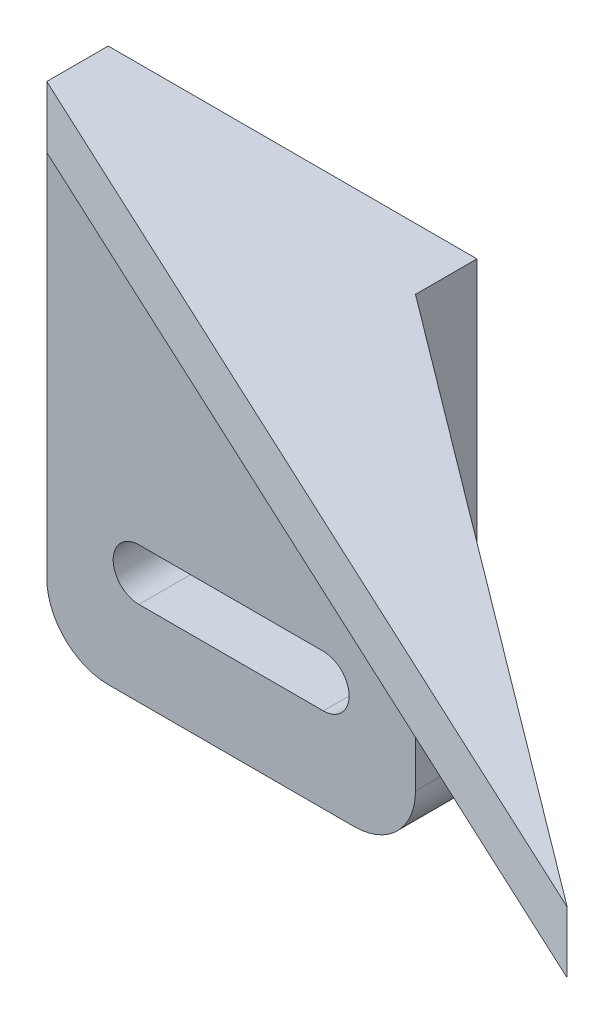
ISO-10303-21;
HEADER;
FILE_DESCRIPTION(('STEP AP214'),'2;1');
FILE_NAME('part.step','',(''),(''),'','','');
FILE_SCHEMA(('AUTOMOTIVE_DESIGN { 1 0 10303 214 1 1 1 1 }'));
ENDSEC;
DATA;
#1=APPLICATION_CONTEXT('core data for automotive mechanical design processes');
#2=APPLICATION_PROTOCOL_DEFINITION('international standard','automotive_design',2000,#1);
#3=PRODUCT_CONTEXT('',#1,'mechanical');
#4=PRODUCT('Part','Part','',(#3));
#5=PRODUCT_RELATED_PRODUCT_CATEGORY('part','',(#4));
#6=PRODUCT_DEFINITION_FORMATION('','',#4);
#7=PRODUCT_DEFINITION_CONTEXT('part definition',#1,'design');
#8=PRODUCT_DEFINITION('design','',#6,#7);
#9=PRODUCT_DEFINITION_SHAPE('','',#8);
#10=(LENGTH_UNIT() NAMED_UNIT(*) SI_UNIT(.MILLI.,.METRE.));
#11=(NAMED_UNIT(*) PLANE_ANGLE_UNIT() SI_UNIT($,.RADIAN.));
#12=(NAMED_UNIT(*) SI_UNIT($,.STERADIAN.) SOLID_ANGLE_UNIT());
#13=UNCERTAINTY_MEASURE_WITH_UNIT(LENGTH_MEASURE(1.E-05),#10,'distance_accuracy_value','');
#14=(GEOMETRIC_REPRESENTATION_CONTEXT(3) GLOBAL_UNCERTAINTY_ASSIGNED_CONTEXT((#13)) GLOBAL_UNIT_ASSIGNED_CONTEXT((#10,
#11,#12)) REPRESENTATION_CONTEXT('',''));
#15=CARTESIAN_POINT('',(0.,0.,0.));
#16=DIRECTION('',(0.,0.,1.));
#17=DIRECTION('',(1.,0.,0.));
#18=AXIS2_PLACEMENT_3D('',#15,#16,#17);
#19=CARTESIAN_POINT('',(0.,0.,5.));
#20=DIRECTION('',(0.,0.,1.));
#21=DIRECTION('',(1.,0.,0.));
#22=AXIS2_PLACEMENT_3D('',#19,#20,#21);
#23=PLANE('',#22);
#24=CARTESIAN_POINT('',(-7.5,-11.,5.));
#25=DIRECTION('',(0.,0.,-1.));
#26=DIRECTION('',(-1.,0.,0.));
#27=AXIS2_PLACEMENT_3D('',#24,#25,#26);
#28=CIRCLE('',#27,2.1);
#29=CARTESIAN_POINT('',(-7.5,-13.1,5.));
#30=VERTEX_POINT('',#29);
#31=CARTESIAN_POINT('',(-7.5,-8.9,5.));
#32=VERTEX_POINT('',#31);
#33=EDGE_CURVE('E123',#30,#32,#28,.T.);
#34=ORIENTED_EDGE('',*,*,#33,.T.);
#35=DIRECTION('',(1.,0.,0.));
#36=VECTOR('',#35,1.);
#37=CARTESIAN_POINT('',(-7.5,-8.9,5.));
#38=LINE('',#37,#36);
#39=CARTESIAN_POINT('',(7.5,-8.9,5.));
#40=VERTEX_POINT('',#39);
#41=EDGE_CURVE('E132',#32,#40,#38,.T.);
#42=ORIENTED_EDGE('',*,*,#41,.T.);
#43=CARTESIAN_POINT('',(7.5,-11.,5.));
#44=DIRECTION('',(0.,0.,-1.));
#45=DIRECTION('',(-1.,0.,0.));
#46=AXIS2_PLACEMENT_3D('',#43,#44,#45);
#47=CIRCLE('',#46,2.1);
#48=CARTESIAN_POINT('',(7.5,-13.1,5.));
#49=VERTEX_POINT('',#48);
#50=EDGE_CURVE('E48',#40,#49,#47,.T.);
#51=ORIENTED_EDGE('',*,*,#50,.T.);
#52=DIRECTION('',(-1.,0.,0.));
#53=VECTOR('',#52,1.);
#54=CARTESIAN_POINT('',(-7.5,-13.1,5.));
#55=LINE('',#54,#53);
#56=EDGE_CURVE('E129',#49,#30,#55,.T.);
#57=ORIENTED_EDGE('',*,*,#56,.T.);
#58=EDGE_LOOP('',(#34,#42,#51,#57));
#59=FACE_BOUND('',#58,.T.);
#60=DIRECTION('',(1.,0.,0.));
#61=VECTOR('',#60,1.);
#62=CARTESIAN_POINT('',(15.,-20.,5.));
#63=LINE('',#62,#61);
#64=CARTESIAN_POINT('',(-9.99999999999999,-20.,5.));
#65=VERTEX_POINT('',#64);
#66=CARTESIAN_POINT('',(10.,-20.,5.));
#67=VERTEX_POINT('',#66);
#68=EDGE_CURVE('E179',#65,#67,#63,.T.);
#69=ORIENTED_EDGE('',*,*,#68,.T.);
#70=CARTESIAN_POINT('',(10.,-15.,5.));
#71=DIRECTION('',(0.,0.,1.));
#72=DIRECTION('',(1.,0.,0.));
#73=AXIS2_PLACEMENT_3D('',#70,#71,#72);
#74=CIRCLE('',#73,5.);
#75=CARTESIAN_POINT('',(15.,-15.,5.));
#76=VERTEX_POINT('',#75);
#77=EDGE_CURVE('E41',#67,#76,#74,.T.);
#78=ORIENTED_EDGE('',*,*,#77,.T.);
#79=DIRECTION('',(0.,1.,0.));
#80=VECTOR('',#79,1.);
#81=CARTESIAN_POINT('',(15.,-20.,5.));
#82=LINE('',#81,#80);
#83=CARTESIAN_POINT('',(15.,15.,5.));
#84=VERTEX_POINT('',#83);
#85=EDGE_CURVE('E183',#76,#84,#82,.T.);
#86=ORIENTED_EDGE('',*,*,#85,.T.);
#87=DIRECTION('',(-1.,0.,0.));
#88=VECTOR('',#87,1.);
#89=CARTESIAN_POINT('',(-15.,15.,5.));
#90=LINE('',#89,#88);
#91=CARTESIAN_POINT('',(-15.,15.,5.));
#92=VERTEX_POINT('',#91);
#93=EDGE_CURVE('E157',#84,#92,#90,.T.);
#94=ORIENTED_EDGE('',*,*,#93,.T.);
#95=DIRECTION('',(0.,-1.,0.));
#96=VECTOR('',#95,1.);
#97=CARTESIAN_POINT('',(-15.,-20.,5.));
#98=LINE('',#97,#96);
#99=CARTESIAN_POINT('',(-15.,-15.,5.));
#100=VERTEX_POINT('',#99);
#101=EDGE_CURVE('E180',#92,#100,#98,.T.);
#102=ORIENTED_EDGE('',*,*,#101,.T.);
#103=CARTESIAN_POINT('',(-10.,-15.,5.));
#104=DIRECTION('',(0.,0.,1.));
#105=DIRECTION('',(1.,0.,0.));
#106=AXIS2_PLACEMENT_3D('',#103,#104,#105);
#107=CIRCLE('',#106,5.);
#108=EDGE_CURVE('E212',#100,#65,#107,.T.);
#109=ORIENTED_EDGE('',*,*,#108,.T.);
#110=EDGE_LOOP('',(#69,#78,#86,#94,#102,#109));
#111=FACE_BOUND('',#110,.T.);
#112=ADVANCED_FACE('F33',(#59,#111),#23,.T.);
#113=CARTESIAN_POINT('',(-15.,-20.,5.));
#114=DIRECTION('',(1.,0.,0.));
#115=DIRECTION('',(0.,0.,-1.));
#116=AXIS2_PLACEMENT_3D('',#113,#114,#115);
#117=PLANE('',#116);
#118=DIRECTION('',(0.,-1.,0.));
#119=VECTOR('',#118,1.);
#120=CARTESIAN_POINT('',(-15.,-20.,0.));
#121=LINE('',#120,#119);
#122=CARTESIAN_POINT('',(-15.,20.,0.));
#123=VERTEX_POINT('',#122);
#124=CARTESIAN_POINT('',(-15.,-15.,0.));
#125=VERTEX_POINT('',#124);
#126=EDGE_CURVE('E174',#123,#125,#121,.T.);
#127=ORIENTED_EDGE('',*,*,#126,.T.);
#128=DIRECTION('',(0.,0.,-1.));
#129=VECTOR('',#128,1.);
#130=CARTESIAN_POINT('',(-15.,-15.,5.));
#131=LINE('',#130,#129);
#132=EDGE_CURVE('E11',#125,#100,#131,.F.);
#133=ORIENTED_EDGE('',*,*,#132,.T.);
#134=ORIENTED_EDGE('',*,*,#101,.F.);
#135=CARTESIAN_POINT('',(-15.,20.,5.));
#136=VERTEX_POINT('',#135);
#137=EDGE_CURVE('E176',#136,#92,#98,.T.);
#138=ORIENTED_EDGE('',*,*,#137,.F.);
#139=DIRECTION('',(0.,0.,-1.));
#140=VECTOR('',#139,1.);
#141=CARTESIAN_POINT('',(-15.,20.,5.));
#142=LINE('',#141,#140);
#143=EDGE_CURVE('E185',#136,#123,#142,.T.);
#144=ORIENTED_EDGE('',*,*,#143,.T.);
#145=EDGE_LOOP('',(#127,#133,#134,#138,#144));
#146=FACE_BOUND('',#145,.T.);
#147=ADVANCED_FACE('F238',(#146),#117,.F.);
#148=CARTESIAN_POINT('',(15.,-20.,5.));
#149=DIRECTION('',(0.,1.,0.));
#150=DIRECTION('',(-1.,0.,0.));
#151=AXIS2_PLACEMENT_3D('',#148,#149,#150);
#152=PLANE('',#151);
#153=DIRECTION('',(1.,0.,0.));
#154=VECTOR('',#153,1.);
#155=CARTESIAN_POINT('',(15.,-20.,0.));
#156=LINE('',#155,#154);
#157=CARTESIAN_POINT('',(-9.99999999999999,-20.,0.));
#158=VERTEX_POINT('',#157);
#159=CARTESIAN_POINT('',(10.,-20.,0.));
#160=VERTEX_POINT('',#159);
#161=EDGE_CURVE('E188',#158,#160,#156,.T.);
#162=ORIENTED_EDGE('',*,*,#161,.T.);
#163=DIRECTION('',(0.,0.,-1.));
#164=VECTOR('',#163,1.);
#165=CARTESIAN_POINT('',(10.,-20.,5.));
#166=LINE('',#165,#164);
#167=EDGE_CURVE('E210',#160,#67,#166,.F.);
#168=ORIENTED_EDGE('',*,*,#167,.T.);
#169=ORIENTED_EDGE('',*,*,#68,.F.);
#170=DIRECTION('',(0.,0.,-1.));
#171=VECTOR('',#170,1.);
#172=CARTESIAN_POINT('',(-9.99999999999999,-20.,5.));
#173=LINE('',#172,#171);
#174=EDGE_CURVE('E207',#65,#158,#173,.T.);
#175=ORIENTED_EDGE('',*,*,#174,.T.);
#176=EDGE_LOOP('',(#162,#168,#169,#175));
#177=FACE_BOUND('',#176,.T.);
#178=ADVANCED_FACE('F231',(#177),#152,.F.);
#179=CARTESIAN_POINT('',(15.,-20.,5.));
#180=DIRECTION('',(-1.,0.,0.));
#181=DIRECTION('',(0.,0.,1.));
#182=AXIS2_PLACEMENT_3D('',#179,#180,#181);
#183=PLANE('',#182);
#184=ORIENTED_EDGE('',*,*,#85,.F.);
#185=DIRECTION('',(0.,0.,-1.));
#186=VECTOR('',#185,1.);
#187=CARTESIAN_POINT('',(15.,-15.,5.));
#188=LINE('',#187,#186);
#189=CARTESIAN_POINT('',(15.,-15.,0.));
#190=VERTEX_POINT('',#189);
#191=EDGE_CURVE('E200',#76,#190,#188,.T.);
#192=ORIENTED_EDGE('',*,*,#191,.T.);
#193=DIRECTION('',(0.,1.,0.));
#194=VECTOR('',#193,1.);
#195=CARTESIAN_POINT('',(15.,-20.,0.));
#196=LINE('',#195,#194);
#197=CARTESIAN_POINT('',(15.,20.,0.));
#198=VERTEX_POINT('',#197);
#199=EDGE_CURVE('E191',#190,#198,#196,.T.);
#200=ORIENTED_EDGE('',*,*,#199,.T.);
#201=DIRECTION('',(0.,0.,-1.));
#202=VECTOR('',#201,1.);
#203=CARTESIAN_POINT('',(15.,20.,5.));
#204=LINE('',#203,#202);
#205=CARTESIAN_POINT('',(15.,20.,5.));
#206=VERTEX_POINT('',#205);
#207=EDGE_CURVE('E197',#206,#198,#204,.T.);
#208=ORIENTED_EDGE('',*,*,#207,.F.);
#209=DIRECTION('',(0.,1.,0.));
#210=VECTOR('',#209,1.);
#211=CARTESIAN_POINT('',(15.,15.,5.));
#212=LINE('',#211,#210);
#213=EDGE_CURVE('E172',#84,#206,#212,.T.);
#214=ORIENTED_EDGE('',*,*,#213,.F.);
#215=EDGE_LOOP('',(#184,#192,#200,#208,#214));
#216=FACE_BOUND('',#215,.T.);
#217=ADVANCED_FACE('F222',(#216),#183,.F.);
#218=CARTESIAN_POINT('',(15.,20.,5.));
#219=DIRECTION('',(0.,-1.,0.));
#220=DIRECTION('',(0.,0.,-1.));
#221=AXIS2_PLACEMENT_3D('',#218,#219,#220);
#222=PLANE('',#221);
#223=DIRECTION('',(-1.,0.,0.));
#224=VECTOR('',#223,1.);
#225=CARTESIAN_POINT('',(15.,20.,0.));
#226=LINE('',#225,#224);
#227=EDGE_CURVE('E193',#198,#123,#226,.T.);
#228=ORIENTED_EDGE('',*,*,#227,.T.);
#229=ORIENTED_EDGE('',*,*,#143,.F.);
#230=DIRECTION('',(0.90630778703665,0.,0.4226182617407));
#231=VECTOR('',#230,1.);
#232=CARTESIAN_POINT('',(-15.,20.,5.));
#233=LINE('',#232,#231);
#234=CARTESIAN_POINT('',(64.3467560588535,20.,42.));
#235=VERTEX_POINT('',#234);
#236=EDGE_CURVE('E153',#136,#235,#233,.T.);
#237=ORIENTED_EDGE('',*,*,#236,.T.);
#238=DIRECTION('',(-0.800078339231539,0.,-0.599895533482708));
#239=VECTOR('',#238,1.);
#240=CARTESIAN_POINT('',(64.3467560588535,20.,42.));
#241=LINE('',#240,#239);
#242=EDGE_CURVE('E161',#235,#206,#241,.T.);
#243=ORIENTED_EDGE('',*,*,#242,.T.);
#244=ORIENTED_EDGE('',*,*,#207,.T.);
#245=EDGE_LOOP('',(#228,#229,#237,#243,#244));
#246=FACE_BOUND('',#245,.T.);
#247=ADVANCED_FACE('F244',(#246),#222,.F.);
#248=CARTESIAN_POINT('',(0.,0.,0.));
#249=DIRECTION('',(0.,0.,1.));
#250=DIRECTION('',(1.,0.,0.));
#251=AXIS2_PLACEMENT_3D('',#248,#249,#250);
#252=PLANE('',#251);
#253=DIRECTION('',(1.,0.,0.));
#254=VECTOR('',#253,1.);
#255=CARTESIAN_POINT('',(-7.5,-8.9,0.));
#256=LINE('',#255,#254);
#257=CARTESIAN_POINT('',(-7.5,-8.9,0.));
#258=VERTEX_POINT('',#257);
#259=CARTESIAN_POINT('',(7.5,-8.9,0.));
#260=VERTEX_POINT('',#259);
#261=EDGE_CURVE('E147',#258,#260,#256,.T.);
#262=ORIENTED_EDGE('',*,*,#261,.F.);
#263=CARTESIAN_POINT('',(-7.5,-11.,0.));
#264=DIRECTION('',(0.,0.,-1.));
#265=DIRECTION('',(-1.,0.,0.));
#266=AXIS2_PLACEMENT_3D('',#263,#264,#265);
#267=CIRCLE('',#266,2.1);
#268=CARTESIAN_POINT('',(-7.5,-13.1,0.));
#269=VERTEX_POINT('',#268);
#270=EDGE_CURVE('E56',#269,#258,#267,.T.);
#271=ORIENTED_EDGE('',*,*,#270,.F.);
#272=DIRECTION('',(-1.,0.,0.));
#273=VECTOR('',#272,1.);
#274=CARTESIAN_POINT('',(-7.5,-13.1,0.));
#275=LINE('',#274,#273);
#276=CARTESIAN_POINT('',(7.5,-13.1,0.));
#277=VERTEX_POINT('',#276);
#278=EDGE_CURVE('E138',#277,#269,#275,.T.);
#279=ORIENTED_EDGE('',*,*,#278,.F.);
#280=CARTESIAN_POINT('',(7.5,-11.,0.));
#281=DIRECTION('',(0.,0.,-1.));
#282=DIRECTION('',(-1.,0.,0.));
#283=AXIS2_PLACEMENT_3D('',#280,#281,#282);
#284=CIRCLE('',#283,2.1);
#285=EDGE_CURVE('E141',#260,#277,#284,.T.);
#286=ORIENTED_EDGE('',*,*,#285,.F.);
#287=EDGE_LOOP('',(#262,#271,#279,#286));
#288=FACE_BOUND('',#287,.T.);
#289=ORIENTED_EDGE('',*,*,#199,.F.);
#290=CARTESIAN_POINT('',(10.,-15.,0.));
#291=DIRECTION('',(0.,0.,1.));
#292=DIRECTION('',(1.,0.,0.));
#293=AXIS2_PLACEMENT_3D('',#290,#291,#292);
#294=CIRCLE('',#293,5.);
#295=EDGE_CURVE('E205',#190,#160,#294,.F.);
#296=ORIENTED_EDGE('',*,*,#295,.T.);
#297=ORIENTED_EDGE('',*,*,#161,.F.);
#298=CARTESIAN_POINT('',(-10.,-15.,0.));
#299=DIRECTION('',(0.,0.,1.));
#300=DIRECTION('',(1.,0.,0.));
#301=AXIS2_PLACEMENT_3D('',#298,#299,#300);
#302=CIRCLE('',#301,5.);
#303=EDGE_CURVE('E203',#158,#125,#302,.F.);
#304=ORIENTED_EDGE('',*,*,#303,.T.);
#305=ORIENTED_EDGE('',*,*,#126,.F.);
#306=ORIENTED_EDGE('',*,*,#227,.F.);
#307=EDGE_LOOP('',(#289,#296,#297,#304,#305,#306));
#308=FACE_BOUND('',#307,.T.);
#309=ADVANCED_FACE('F228',(#288,#308),#252,.F.);
#310=CARTESIAN_POINT('',(64.3467560588535,15.,42.));
#311=DIRECTION('',(0.599895533482708,0.,-0.800078339231539));
#312=DIRECTION('',(-0.800078339231539,0.,-0.599895533482708));
#313=AXIS2_PLACEMENT_3D('',#310,#311,#312);
#314=PLANE('',#313);
#315=ORIENTED_EDGE('',*,*,#242,.F.);
#316=DIRECTION('',(0.,1.,0.));
#317=VECTOR('',#316,1.);
#318=CARTESIAN_POINT('',(64.3467560588535,15.,42.));
#319=LINE('',#318,#317);
#320=CARTESIAN_POINT('',(64.3467560588535,15.,42.));
#321=VERTEX_POINT('',#320);
#322=EDGE_CURVE('E167',#321,#235,#319,.T.);
#323=ORIENTED_EDGE('',*,*,#322,.F.);
#324=DIRECTION('',(-0.800078339231539,0.,-0.599895533482708));
#325=VECTOR('',#324,1.);
#326=CARTESIAN_POINT('',(64.3467560588535,15.,42.));
#327=LINE('',#326,#325);
#328=EDGE_CURVE('E164',#321,#84,#327,.T.);
#329=ORIENTED_EDGE('',*,*,#328,.T.);
#330=ORIENTED_EDGE('',*,*,#213,.T.);
#331=EDGE_LOOP('',(#315,#323,#329,#330));
#332=FACE_BOUND('',#331,.T.);
#333=ADVANCED_FACE('F247',(#332),#314,.T.);
#334=CARTESIAN_POINT('',(-15.,15.,5.));
#335=DIRECTION('',(-0.4226182617407,0.,0.90630778703665));
#336=DIRECTION('',(0.90630778703665,0.,0.4226182617407));
#337=AXIS2_PLACEMENT_3D('',#334,#335,#336);
#338=PLANE('',#337);
#339=ORIENTED_EDGE('',*,*,#236,.F.);
#340=ORIENTED_EDGE('',*,*,#137,.T.);
#341=DIRECTION('',(0.90630778703665,0.,0.4226182617407));
#342=VECTOR('',#341,1.);
#343=CARTESIAN_POINT('',(-15.,15.,5.));
#344=LINE('',#343,#342);
#345=EDGE_CURVE('E160',#92,#321,#344,.T.);
#346=ORIENTED_EDGE('',*,*,#345,.T.);
#347=ORIENTED_EDGE('',*,*,#322,.T.);
#348=EDGE_LOOP('',(#339,#340,#346,#347));
#349=FACE_BOUND('',#348,.T.);
#350=ADVANCED_FACE('F252',(#349),#338,.T.);
#351=CARTESIAN_POINT('',(0.,15.,0.));
#352=DIRECTION('',(0.,1.,0.));
#353=DIRECTION('',(0.,0.,1.));
#354=AXIS2_PLACEMENT_3D('',#351,#352,#353);
#355=PLANE('',#354);
#356=ORIENTED_EDGE('',*,*,#93,.F.);
#357=ORIENTED_EDGE('',*,*,#328,.F.);
#358=ORIENTED_EDGE('',*,*,#345,.F.);
#359=EDGE_LOOP('',(#356,#357,#358));
#360=FACE_BOUND('',#359,.T.);
#361=ADVANCED_FACE('F250',(#360),#355,.F.);
#362=CARTESIAN_POINT('',(10.,-15.,5.));
#363=DIRECTION('',(0.,0.,-1.));
#364=DIRECTION('',(-1.,0.,0.));
#365=AXIS2_PLACEMENT_3D('',#362,#363,#364);
#366=CYLINDRICAL_SURFACE('',#365,5.);
#367=ORIENTED_EDGE('',*,*,#77,.F.);
#368=ORIENTED_EDGE('',*,*,#167,.F.);
#369=ORIENTED_EDGE('',*,*,#295,.F.);
#370=ORIENTED_EDGE('',*,*,#191,.F.);
#371=EDGE_LOOP('',(#367,#368,#369,#370));
#372=FACE_BOUND('',#371,.T.);
#373=ADVANCED_FACE('F225',(#372),#366,.T.);
#374=CARTESIAN_POINT('',(-10.,-15.,5.));
#375=DIRECTION('',(0.,0.,-1.));
#376=DIRECTION('',(-1.,0.,0.));
#377=AXIS2_PLACEMENT_3D('',#374,#375,#376);
#378=CYLINDRICAL_SURFACE('',#377,5.);
#379=ORIENTED_EDGE('',*,*,#108,.F.);
#380=ORIENTED_EDGE('',*,*,#132,.F.);
#381=ORIENTED_EDGE('',*,*,#303,.F.);
#382=ORIENTED_EDGE('',*,*,#174,.F.);
#383=EDGE_LOOP('',(#379,#380,#381,#382));
#384=FACE_BOUND('',#383,.T.);
#385=ADVANCED_FACE('F35',(#384),#378,.T.);
#386=CARTESIAN_POINT('',(-7.5,-11.,5.));
#387=DIRECTION('',(0.,0.,-1.));
#388=DIRECTION('',(-1.,0.,0.));
#389=AXIS2_PLACEMENT_3D('',#386,#387,#388);
#390=CYLINDRICAL_SURFACE('',#389,2.1);
#391=ORIENTED_EDGE('',*,*,#270,.T.);
#392=DIRECTION('',(0.,0.,-1.));
#393=VECTOR('',#392,1.);
#394=CARTESIAN_POINT('',(-7.5,-8.9,5.));
#395=LINE('',#394,#393);
#396=EDGE_CURVE('E119',#32,#258,#395,.T.);
#397=ORIENTED_EDGE('',*,*,#396,.F.);
#398=ORIENTED_EDGE('',*,*,#33,.F.);
#399=DIRECTION('',(0.,0.,-1.));
#400=VECTOR('',#399,1.);
#401=CARTESIAN_POINT('',(-7.5,-13.1,5.));
#402=LINE('',#401,#400);
#403=EDGE_CURVE('E151',#30,#269,#402,.T.);
#404=ORIENTED_EDGE('',*,*,#403,.T.);
#405=EDGE_LOOP('',(#391,#397,#398,#404));
#406=FACE_BOUND('',#405,.T.);
#407=ADVANCED_FACE('F121',(#406),#390,.F.);
#408=CARTESIAN_POINT('',(-7.5,-13.1,5.));
#409=DIRECTION('',(0.,-1.,0.));
#410=DIRECTION('',(1.,0.,0.));
#411=AXIS2_PLACEMENT_3D('',#408,#409,#410);
#412=PLANE('',#411);
#413=ORIENTED_EDGE('',*,*,#278,.T.);
#414=ORIENTED_EDGE('',*,*,#403,.F.);
#415=ORIENTED_EDGE('',*,*,#56,.F.);
#416=DIRECTION('',(0.,0.,-1.));
#417=VECTOR('',#416,1.);
#418=CARTESIAN_POINT('',(7.5,-13.1,5.));
#419=LINE('',#418,#417);
#420=EDGE_CURVE('E154',#49,#277,#419,.T.);
#421=ORIENTED_EDGE('',*,*,#420,.T.);
#422=EDGE_LOOP('',(#413,#414,#415,#421));
#423=FACE_BOUND('',#422,.T.);
#424=ADVANCED_FACE('F283',(#423),#412,.F.);
#425=CARTESIAN_POINT('',(7.5,-11.,5.));
#426=DIRECTION('',(0.,0.,-1.));
#427=DIRECTION('',(-1.,0.,0.));
#428=AXIS2_PLACEMENT_3D('',#425,#426,#427);
#429=CYLINDRICAL_SURFACE('',#428,2.1);
#430=ORIENTED_EDGE('',*,*,#285,.T.);
#431=ORIENTED_EDGE('',*,*,#420,.F.);
#432=ORIENTED_EDGE('',*,*,#50,.F.);
#433=DIRECTION('',(0.,0.,-1.));
#434=VECTOR('',#433,1.);
#435=CARTESIAN_POINT('',(7.5,-8.9,5.));
#436=LINE('',#435,#434);
#437=EDGE_CURVE('E128',#40,#260,#436,.T.);
#438=ORIENTED_EDGE('',*,*,#437,.T.);
#439=EDGE_LOOP('',(#430,#431,#432,#438));
#440=FACE_BOUND('',#439,.T.);
#441=ADVANCED_FACE('F288',(#440),#429,.F.);
#442=CARTESIAN_POINT('',(-7.5,-8.9,5.));
#443=DIRECTION('',(0.,1.,0.));
#444=DIRECTION('',(-1.,0.,0.));
#445=AXIS2_PLACEMENT_3D('',#442,#443,#444);
#446=PLANE('',#445);
#447=ORIENTED_EDGE('',*,*,#261,.T.);
#448=ORIENTED_EDGE('',*,*,#437,.F.);
#449=ORIENTED_EDGE('',*,*,#41,.F.);
#450=ORIENTED_EDGE('',*,*,#396,.T.);
#451=EDGE_LOOP('',(#447,#448,#449,#450));
#452=FACE_BOUND('',#451,.T.);
#453=ADVANCED_FACE('F133',(#452),#446,.F.);
#454=CLOSED_SHELL('',(#112,#147,#178,#217,#247,#309,#333,#350,#361,#373,#385,#407,#424,#441,#453));
#455=MANIFOLD_SOLID_BREP('B2',#454);
#456=ADVANCED_BREP_SHAPE_REPRESENTATION('',(#18,#455),#14);
#457=SHAPE_DEFINITION_REPRESENTATION(#9,#456);
ENDSEC;
END-ISO-10303-21;
